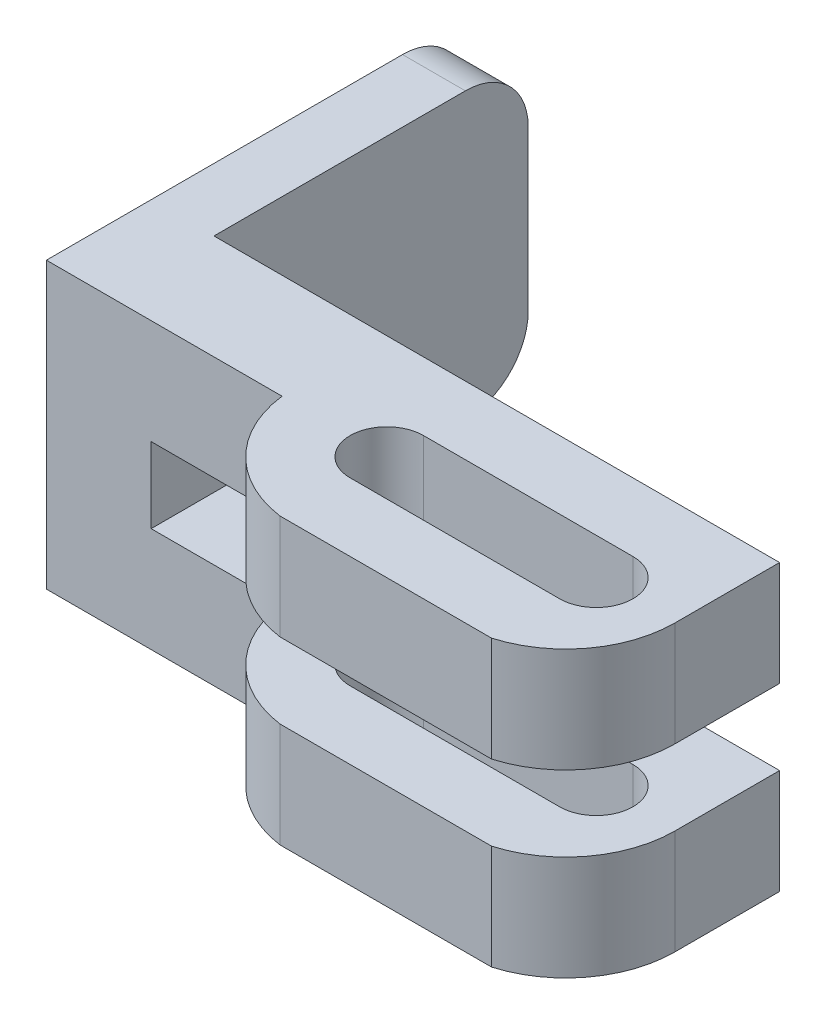
ISO-10303-21;
HEADER;
FILE_DESCRIPTION(('STEP AP214'),'2;1');
FILE_NAME('part.step','',(''),(''),'','','');
FILE_SCHEMA(('AUTOMOTIVE_DESIGN { 1 0 10303 214 1 1 1 1 }'));
ENDSEC;
DATA;
#1=APPLICATION_CONTEXT('core data for automotive mechanical design processes');
#2=APPLICATION_PROTOCOL_DEFINITION('international standard','automotive_design',2000,#1);
#3=PRODUCT_CONTEXT('',#1,'mechanical');
#4=PRODUCT('Part','Part','',(#3));
#5=PRODUCT_RELATED_PRODUCT_CATEGORY('part','',(#4));
#6=PRODUCT_DEFINITION_FORMATION('','',#4);
#7=PRODUCT_DEFINITION_CONTEXT('part definition',#1,'design');
#8=PRODUCT_DEFINITION('design','',#6,#7);
#9=PRODUCT_DEFINITION_SHAPE('','',#8);
#10=(LENGTH_UNIT() NAMED_UNIT(*) SI_UNIT(.MILLI.,.METRE.));
#11=(NAMED_UNIT(*) PLANE_ANGLE_UNIT() SI_UNIT($,.RADIAN.));
#12=(NAMED_UNIT(*) SI_UNIT($,.STERADIAN.) SOLID_ANGLE_UNIT());
#13=UNCERTAINTY_MEASURE_WITH_UNIT(LENGTH_MEASURE(1.E-05),#10,'distance_accuracy_value','');
#14=(GEOMETRIC_REPRESENTATION_CONTEXT(3) GLOBAL_UNCERTAINTY_ASSIGNED_CONTEXT((#13)) GLOBAL_UNIT_ASSIGNED_CONTEXT((#10,
#11,#12)) REPRESENTATION_CONTEXT('',''));
#15=CARTESIAN_POINT('',(0.,0.,0.));
#16=DIRECTION('',(0.,0.,1.));
#17=DIRECTION('',(1.,0.,0.));
#18=AXIS2_PLACEMENT_3D('',#15,#16,#17);
#19=CARTESIAN_POINT('',(0.,0.,0.));
#20=DIRECTION('',(0.,0.,1.));
#21=DIRECTION('',(1.,0.,0.));
#22=AXIS2_PLACEMENT_3D('',#19,#20,#21);
#23=PLANE('',#22);
#24=DIRECTION('',(0.,-1.,0.));
#25=VECTOR('',#24,1.);
#26=CARTESIAN_POINT('',(63.,0.,0.));
#27=LINE('',#26,#25);
#28=CARTESIAN_POINT('',(62.9999999999999,6.80000000000001,0.));
#29=VERTEX_POINT('',#28);
#30=CARTESIAN_POINT('',(63.,-6.79999999999999,0.));
#31=VERTEX_POINT('',#30);
#32=EDGE_CURVE('E322',#29,#31,#27,.T.);
#33=ORIENTED_EDGE('',*,*,#32,.F.);
#34=DIRECTION('',(-1.,0.,0.));
#35=VECTOR('',#34,1.);
#36=CARTESIAN_POINT('',(-90.,6.79999999999999,0.));
#37=LINE('',#36,#35);
#38=CARTESIAN_POINT('',(90.,6.80000000000001,0.));
#39=VERTEX_POINT('',#38);
#40=EDGE_CURVE('E376',#39,#29,#37,.T.);
#41=ORIENTED_EDGE('',*,*,#40,.F.);
#42=DIRECTION('',(0.,1.,0.));
#43=VECTOR('',#42,1.);
#44=CARTESIAN_POINT('',(90.,6.80000000000001,0.));
#45=LINE('',#44,#43);
#46=CARTESIAN_POINT('',(90.,1.80000000000001,0.));
#47=VERTEX_POINT('',#46);
#48=EDGE_CURVE('E399',#47,#39,#45,.T.);
#49=ORIENTED_EDGE('',*,*,#48,.F.);
#50=DIRECTION('',(1.,0.,0.));
#51=VECTOR('',#50,1.);
#52=CARTESIAN_POINT('',(90.,1.80000000000001,0.));
#53=LINE('',#52,#51);
#54=CARTESIAN_POINT('',(65.,1.80000000000001,0.));
#55=VERTEX_POINT('',#54);
#56=EDGE_CURVE('E396',#55,#47,#53,.T.);
#57=ORIENTED_EDGE('',*,*,#56,.F.);
#58=DIRECTION('',(0.,1.,0.));
#59=VECTOR('',#58,1.);
#60=CARTESIAN_POINT('',(65.,-1.79999999999999,0.));
#61=LINE('',#60,#59);
#62=CARTESIAN_POINT('',(65.,-1.79999999999999,0.));
#63=VERTEX_POINT('',#62);
#64=EDGE_CURVE('E393',#63,#55,#61,.T.);
#65=ORIENTED_EDGE('',*,*,#64,.F.);
#66=DIRECTION('',(-1.,0.,0.));
#67=VECTOR('',#66,1.);
#68=CARTESIAN_POINT('',(90.,-1.79999999999999,0.));
#69=LINE('',#68,#67);
#70=CARTESIAN_POINT('',(90.,-1.79999999999999,0.));
#71=VERTEX_POINT('',#70);
#72=EDGE_CURVE('E390',#71,#63,#69,.T.);
#73=ORIENTED_EDGE('',*,*,#72,.F.);
#74=DIRECTION('',(0.,1.,0.));
#75=VECTOR('',#74,1.);
#76=CARTESIAN_POINT('',(90.,-6.79999999999999,0.));
#77=LINE('',#76,#75);
#78=CARTESIAN_POINT('',(90.,-6.79999999999999,0.));
#79=VERTEX_POINT('',#78);
#80=EDGE_CURVE('E387',#79,#71,#77,.T.);
#81=ORIENTED_EDGE('',*,*,#80,.F.);
#82=DIRECTION('',(1.,0.,0.));
#83=VECTOR('',#82,1.);
#84=CARTESIAN_POINT('',(-90.,-6.80000000000001,0.));
#85=LINE('',#84,#83);
#86=EDGE_CURVE('E371',#31,#79,#85,.T.);
#87=ORIENTED_EDGE('',*,*,#86,.F.);
#88=EDGE_LOOP('',(#33,#41,#49,#57,#65,#73,#81,#87));
#89=FACE_BOUND('',#88,.T.);
#90=ADVANCED_FACE('F127',(#89),#23,.F.);
#91=CARTESIAN_POINT('',(-90.,-6.80000000000001,10.));
#92=DIRECTION('',(0.,1.,0.));
#93=DIRECTION('',(-1.,0.,0.));
#94=AXIS2_PLACEMENT_3D('',#91,#92,#93);
#95=PLANE('',#94);
#96=CARTESIAN_POINT('',(86.25,-6.80000000000001,5.));
#97=DIRECTION('',(0.,1.,0.));
#98=DIRECTION('',(0.,0.,1.));
#99=AXIS2_PLACEMENT_3D('',#96,#97,#98);
#100=CIRCLE('',#99,1.75);
#101=CARTESIAN_POINT('',(86.25,-6.80000000000001,3.25));
#102=VERTEX_POINT('',#101);
#103=CARTESIAN_POINT('',(86.25,-6.80000000000001,6.75));
#104=VERTEX_POINT('',#103);
#105=EDGE_CURVE('E464',#102,#104,#100,.F.);
#106=ORIENTED_EDGE('',*,*,#105,.F.);
#107=DIRECTION('',(-1.,0.,0.));
#108=VECTOR('',#107,1.);
#109=CARTESIAN_POINT('',(0.,-6.80000000000001,3.25));
#110=LINE('',#109,#108);
#111=CARTESIAN_POINT('',(76.25,-6.79999999999999,3.25));
#112=VERTEX_POINT('',#111);
#113=EDGE_CURVE('E466',#102,#112,#110,.T.);
#114=ORIENTED_EDGE('',*,*,#113,.T.);
#115=CARTESIAN_POINT('',(76.25,-6.80000000000001,5.));
#116=DIRECTION('',(0.,1.,0.));
#117=DIRECTION('',(0.,0.,1.));
#118=AXIS2_PLACEMENT_3D('',#115,#116,#117);
#119=CIRCLE('',#118,1.75);
#120=CARTESIAN_POINT('',(76.25,-6.80000000000001,6.75));
#121=VERTEX_POINT('',#120);
#122=EDGE_CURVE('E470',#112,#121,#119,.T.);
#123=ORIENTED_EDGE('',*,*,#122,.T.);
#124=DIRECTION('',(-1.,0.,0.));
#125=VECTOR('',#124,1.);
#126=CARTESIAN_POINT('',(0.,-6.80000000000001,6.75));
#127=LINE('',#126,#125);
#128=EDGE_CURVE('E473',#104,#121,#127,.T.);
#129=ORIENTED_EDGE('',*,*,#128,.F.);
#130=EDGE_LOOP('',(#106,#114,#123,#129));
#131=FACE_BOUND('',#130,.T.);
#132=DIRECTION('',(1.,0.,0.));
#133=VECTOR('',#132,1.);
#134=CARTESIAN_POINT('',(0.,-6.80000000000001,5.));
#135=LINE('',#134,#133);
#136=CARTESIAN_POINT('',(60.,-6.79999999999999,5.));
#137=VERTEX_POINT('',#136);
#138=CARTESIAN_POINT('',(71.25,-6.80000000000001,5.));
#139=VERTEX_POINT('',#138);
#140=EDGE_CURVE('E318',#137,#139,#135,.T.);
#141=ORIENTED_EDGE('',*,*,#140,.F.);
#142=DIRECTION('',(0.,0.,1.));
#143=VECTOR('',#142,1.);
#144=CARTESIAN_POINT('',(60.,-6.79999999999999,-15.));
#145=LINE('',#144,#143);
#146=CARTESIAN_POINT('',(60.,-6.79999999999999,-12.));
#147=VERTEX_POINT('',#146);
#148=EDGE_CURVE('E302',#147,#137,#145,.T.);
#149=ORIENTED_EDGE('',*,*,#148,.F.);
#150=DIRECTION('',(-1.,0.,0.));
#151=VECTOR('',#150,1.);
#152=CARTESIAN_POINT('',(63.,-6.79999999999999,-12.));
#153=LINE('',#152,#151);
#154=CARTESIAN_POINT('',(63.,-6.79999999999999,-12.));
#155=VERTEX_POINT('',#154);
#156=EDGE_CURVE('E432',#147,#155,#153,.F.);
#157=ORIENTED_EDGE('',*,*,#156,.T.);
#158=DIRECTION('',(0.,0.,1.));
#159=VECTOR('',#158,1.);
#160=CARTESIAN_POINT('',(63.,-6.79999999999999,-15.));
#161=LINE('',#160,#159);
#162=EDGE_CURVE('E312',#155,#31,#161,.T.);
#163=ORIENTED_EDGE('',*,*,#162,.T.);
#164=ORIENTED_EDGE('',*,*,#86,.T.);
#165=DIRECTION('',(0.,0.,-1.));
#166=VECTOR('',#165,1.);
#167=CARTESIAN_POINT('',(90.,-6.79999999999999,10.));
#168=LINE('',#167,#166);
#169=CARTESIAN_POINT('',(90.,-6.80000000000001,5.));
#170=VERTEX_POINT('',#169);
#171=EDGE_CURVE('E413',#170,#79,#168,.T.);
#172=ORIENTED_EDGE('',*,*,#171,.F.);
#173=CARTESIAN_POINT('',(84.7916666666666,-6.80000000000001,5.));
#174=DIRECTION('',(0.,1.,0.));
#175=DIRECTION('',(0.,0.,1.));
#176=AXIS2_PLACEMENT_3D('',#173,#174,#175);
#177=CIRCLE('',#176,5.20833333333336);
#178=CARTESIAN_POINT('',(86.25,-6.80000000000001,10.));
#179=VERTEX_POINT('',#178);
#180=EDGE_CURVE('E501',#170,#179,#177,.F.);
#181=ORIENTED_EDGE('',*,*,#180,.T.);
#182=DIRECTION('',(1.,0.,0.));
#183=VECTOR('',#182,1.);
#184=CARTESIAN_POINT('',(-90.,-6.80000000000001,10.));
#185=LINE('',#184,#183);
#186=CARTESIAN_POINT('',(76.15,-6.80000000000001,10.));
#187=VERTEX_POINT('',#186);
#188=EDGE_CURVE('E372',#187,#179,#185,.T.);
#189=ORIENTED_EDGE('',*,*,#188,.F.);
#190=CARTESIAN_POINT('',(76.9398616508435,-6.80000000000001,4.32493558217343));
#191=DIRECTION('',(0.,1.,0.));
#192=DIRECTION('',(0.,0.,1.));
#193=AXIS2_PLACEMENT_3D('',#190,#191,#192);
#194=CIRCLE('',#193,5.72976767190037);
#195=EDGE_CURVE('E327',#187,#139,#194,.F.);
#196=ORIENTED_EDGE('',*,*,#195,.T.);
#197=EDGE_LOOP('',(#141,#149,#157,#163,#164,#172,#181,#189,#196));
#198=FACE_BOUND('',#197,.T.);
#199=ADVANCED_FACE('F325',(#131,#198),#95,.F.);
#200=CARTESIAN_POINT('',(-90.,6.79999999999999,10.));
#201=DIRECTION('',(0.,-1.,0.));
#202=DIRECTION('',(1.,0.,0.));
#203=AXIS2_PLACEMENT_3D('',#200,#201,#202);
#204=PLANE('',#203);
#205=CARTESIAN_POINT('',(86.25,6.8,5.));
#206=DIRECTION('',(0.,1.,0.));
#207=DIRECTION('',(0.,0.,1.));
#208=AXIS2_PLACEMENT_3D('',#205,#206,#207);
#209=CIRCLE('',#208,1.75);
#210=CARTESIAN_POINT('',(86.25,6.80000000000001,3.25));
#211=VERTEX_POINT('',#210);
#212=CARTESIAN_POINT('',(86.25,6.8,6.75));
#213=VERTEX_POINT('',#212);
#214=EDGE_CURVE('E463',#211,#213,#209,.F.);
#215=ORIENTED_EDGE('',*,*,#214,.T.);
#216=DIRECTION('',(-1.,0.,0.));
#217=VECTOR('',#216,1.);
#218=CARTESIAN_POINT('',(0.,6.8,6.75));
#219=LINE('',#218,#217);
#220=CARTESIAN_POINT('',(76.25,6.8,6.75));
#221=VERTEX_POINT('',#220);
#222=EDGE_CURVE('E467',#213,#221,#219,.T.);
#223=ORIENTED_EDGE('',*,*,#222,.T.);
#224=CARTESIAN_POINT('',(76.25,6.8,5.));
#225=DIRECTION('',(0.,1.,0.));
#226=DIRECTION('',(0.,0.,1.));
#227=AXIS2_PLACEMENT_3D('',#224,#225,#226);
#228=CIRCLE('',#227,1.75);
#229=CARTESIAN_POINT('',(76.25,6.8,3.25));
#230=VERTEX_POINT('',#229);
#231=EDGE_CURVE('E481',#230,#221,#228,.T.);
#232=ORIENTED_EDGE('',*,*,#231,.F.);
#233=DIRECTION('',(-1.,0.,0.));
#234=VECTOR('',#233,1.);
#235=CARTESIAN_POINT('',(0.,6.8,3.25));
#236=LINE('',#235,#234);
#237=EDGE_CURVE('E478',#211,#230,#236,.T.);
#238=ORIENTED_EDGE('',*,*,#237,.F.);
#239=EDGE_LOOP('',(#215,#223,#232,#238));
#240=FACE_BOUND('',#239,.T.);
#241=DIRECTION('',(0.,0.,1.));
#242=VECTOR('',#241,1.);
#243=CARTESIAN_POINT('',(60.,6.80000000000001,-15.));
#244=LINE('',#243,#242);
#245=CARTESIAN_POINT('',(60.,6.80000000000001,-12.));
#246=VERTEX_POINT('',#245);
#247=CARTESIAN_POINT('',(60.,6.80000000000003,5.));
#248=VERTEX_POINT('',#247);
#249=EDGE_CURVE('E448',#246,#248,#244,.T.);
#250=ORIENTED_EDGE('',*,*,#249,.T.);
#251=DIRECTION('',(1.,0.,0.));
#252=VECTOR('',#251,1.);
#253=CARTESIAN_POINT('',(0.,6.8,5.));
#254=LINE('',#253,#252);
#255=CARTESIAN_POINT('',(71.25,6.8,5.));
#256=VERTEX_POINT('',#255);
#257=EDGE_CURVE('E321',#248,#256,#254,.T.);
#258=ORIENTED_EDGE('',*,*,#257,.T.);
#259=CARTESIAN_POINT('',(76.9398616508435,6.8,4.32493558217343));
#260=DIRECTION('',(0.,1.,0.));
#261=DIRECTION('',(0.,0.,1.));
#262=AXIS2_PLACEMENT_3D('',#259,#260,#261);
#263=CIRCLE('',#262,5.72976767190037);
#264=CARTESIAN_POINT('',(76.15,6.8,10.));
#265=VERTEX_POINT('',#264);
#266=EDGE_CURVE('E335',#265,#256,#263,.F.);
#267=ORIENTED_EDGE('',*,*,#266,.F.);
#268=DIRECTION('',(-1.,0.,0.));
#269=VECTOR('',#268,1.);
#270=CARTESIAN_POINT('',(-90.,6.79999999999999,10.));
#271=LINE('',#270,#269);
#272=CARTESIAN_POINT('',(86.2499999999999,6.80000000000001,10.));
#273=VERTEX_POINT('',#272);
#274=EDGE_CURVE('E382',#273,#265,#271,.T.);
#275=ORIENTED_EDGE('',*,*,#274,.F.);
#276=CARTESIAN_POINT('',(84.7916666666666,6.8,5.));
#277=DIRECTION('',(0.,1.,0.));
#278=DIRECTION('',(0.,0.,1.));
#279=AXIS2_PLACEMENT_3D('',#276,#277,#278);
#280=CIRCLE('',#279,5.20833333333336);
#281=CARTESIAN_POINT('',(90.,6.8,5.));
#282=VERTEX_POINT('',#281);
#283=EDGE_CURVE('E489',#282,#273,#280,.F.);
#284=ORIENTED_EDGE('',*,*,#283,.F.);
#285=DIRECTION('',(0.,0.,-1.));
#286=VECTOR('',#285,1.);
#287=CARTESIAN_POINT('',(90.,6.80000000000001,10.));
#288=LINE('',#287,#286);
#289=EDGE_CURVE('E385',#282,#39,#288,.T.);
#290=ORIENTED_EDGE('',*,*,#289,.T.);
#291=ORIENTED_EDGE('',*,*,#40,.T.);
#292=DIRECTION('',(0.,0.,1.));
#293=VECTOR('',#292,1.);
#294=CARTESIAN_POINT('',(63.,6.80000000000001,-15.));
#295=LINE('',#294,#293);
#296=CARTESIAN_POINT('',(63.,6.80000000000001,-12.));
#297=VERTEX_POINT('',#296);
#298=EDGE_CURVE('E443',#297,#29,#295,.T.);
#299=ORIENTED_EDGE('',*,*,#298,.F.);
#300=DIRECTION('',(1.,0.,0.));
#301=VECTOR('',#300,1.);
#302=CARTESIAN_POINT('',(60.,6.80000000000001,-12.));
#303=LINE('',#302,#301);
#304=EDGE_CURVE('E430',#297,#246,#303,.F.);
#305=ORIENTED_EDGE('',*,*,#304,.T.);
#306=EDGE_LOOP('',(#250,#258,#267,#275,#284,#290,#291,#299,#305));
#307=FACE_BOUND('',#306,.T.);
#308=ADVANCED_FACE('F446',(#240,#307),#204,.F.);
#309=CARTESIAN_POINT('',(90.,-1.79999999999999,10.));
#310=DIRECTION('',(0.,-1.,0.));
#311=DIRECTION('',(1.,0.,0.));
#312=AXIS2_PLACEMENT_3D('',#309,#310,#311);
#313=PLANE('',#312);
#314=CARTESIAN_POINT('',(86.25,-1.79999999999999,5.));
#315=DIRECTION('',(0.,-1.,0.));
#316=DIRECTION('',(1.,0.,0.));
#317=AXIS2_PLACEMENT_3D('',#314,#315,#316);
#318=CIRCLE('',#317,1.75);
#319=CARTESIAN_POINT('',(86.25,-1.79999999999999,6.75));
#320=VERTEX_POINT('',#319);
#321=CARTESIAN_POINT('',(86.25,-1.79999999999999,3.25));
#322=VERTEX_POINT('',#321);
#323=EDGE_CURVE('E368',#320,#322,#318,.F.);
#324=ORIENTED_EDGE('',*,*,#323,.F.);
#325=DIRECTION('',(1.,0.,0.));
#326=VECTOR('',#325,1.);
#327=CARTESIAN_POINT('',(90.,-1.79999999999999,6.75));
#328=LINE('',#327,#326);
#329=CARTESIAN_POINT('',(76.25,-1.79999999999999,6.75));
#330=VERTEX_POINT('',#329);
#331=EDGE_CURVE('E366',#330,#320,#328,.T.);
#332=ORIENTED_EDGE('',*,*,#331,.F.);
#333=CARTESIAN_POINT('',(76.25,-1.79999999999999,5.));
#334=DIRECTION('',(0.,-1.,0.));
#335=DIRECTION('',(1.,0.,0.));
#336=AXIS2_PLACEMENT_3D('',#333,#334,#335);
#337=CIRCLE('',#336,1.75);
#338=CARTESIAN_POINT('',(76.25,-1.79999999999999,3.25));
#339=VERTEX_POINT('',#338);
#340=EDGE_CURVE('E363',#330,#339,#337,.T.);
#341=ORIENTED_EDGE('',*,*,#340,.T.);
#342=DIRECTION('',(1.,0.,0.));
#343=VECTOR('',#342,1.);
#344=CARTESIAN_POINT('',(90.,-1.79999999999999,3.25));
#345=LINE('',#344,#343);
#346=EDGE_CURVE('E360',#339,#322,#345,.T.);
#347=ORIENTED_EDGE('',*,*,#346,.T.);
#348=EDGE_LOOP('',(#324,#332,#341,#347));
#349=FACE_BOUND('',#348,.T.);
#350=DIRECTION('',(-1.,0.,0.));
#351=VECTOR('',#350,1.);
#352=CARTESIAN_POINT('',(90.,-1.79999999999999,10.));
#353=LINE('',#352,#351);
#354=CARTESIAN_POINT('',(86.25,-1.79999999999999,10.));
#355=VERTEX_POINT('',#354);
#356=CARTESIAN_POINT('',(76.15,-1.79999999999999,10.));
#357=VERTEX_POINT('',#356);
#358=EDGE_CURVE('E375',#355,#357,#353,.T.);
#359=ORIENTED_EDGE('',*,*,#358,.F.);
#360=CARTESIAN_POINT('',(84.7916666666666,-1.79999999999999,5.));
#361=DIRECTION('',(0.,-1.,0.));
#362=DIRECTION('',(1.,0.,0.));
#363=AXIS2_PLACEMENT_3D('',#360,#361,#362);
#364=CIRCLE('',#363,5.20833333333336);
#365=CARTESIAN_POINT('',(90.,-1.79999999999999,5.));
#366=VERTEX_POINT('',#365);
#367=EDGE_CURVE('E351',#355,#366,#364,.F.);
#368=ORIENTED_EDGE('',*,*,#367,.T.);
#369=DIRECTION('',(0.,0.,-1.));
#370=VECTOR('',#369,1.);
#371=CARTESIAN_POINT('',(90.,-1.79999999999999,10.));
#372=LINE('',#371,#370);
#373=EDGE_CURVE('E411',#366,#71,#372,.T.);
#374=ORIENTED_EDGE('',*,*,#373,.T.);
#375=ORIENTED_EDGE('',*,*,#72,.T.);
#376=DIRECTION('',(0.,0.,-1.));
#377=VECTOR('',#376,1.);
#378=CARTESIAN_POINT('',(65.,-1.79999999999999,10.));
#379=LINE('',#378,#377);
#380=CARTESIAN_POINT('',(65.,-1.79999999999999,5.));
#381=VERTEX_POINT('',#380);
#382=EDGE_CURVE('E409',#381,#63,#379,.T.);
#383=ORIENTED_EDGE('',*,*,#382,.F.);
#384=DIRECTION('',(-1.,0.,0.));
#385=VECTOR('',#384,1.);
#386=CARTESIAN_POINT('',(90.,-1.79999999999999,5.));
#387=LINE('',#386,#385);
#388=CARTESIAN_POINT('',(71.25,-1.79999999999999,5.));
#389=VERTEX_POINT('',#388);
#390=EDGE_CURVE('E358',#389,#381,#387,.T.);
#391=ORIENTED_EDGE('',*,*,#390,.F.);
#392=CARTESIAN_POINT('',(76.9398616508435,-1.79999999999999,4.32493558217343));
#393=DIRECTION('',(0.,-1.,0.));
#394=DIRECTION('',(1.,0.,0.));
#395=AXIS2_PLACEMENT_3D('',#392,#393,#394);
#396=CIRCLE('',#395,5.72976767190037);
#397=EDGE_CURVE('E345',#389,#357,#396,.F.);
#398=ORIENTED_EDGE('',*,*,#397,.T.);
#399=EDGE_LOOP('',(#359,#368,#374,#375,#383,#391,#398));
#400=FACE_BOUND('',#399,.T.);
#401=ADVANCED_FACE('F544',(#349,#400),#313,.F.);
#402=CARTESIAN_POINT('',(65.,-1.79999999999999,10.));
#403=DIRECTION('',(-1.,0.,0.));
#404=DIRECTION('',(0.,0.,1.));
#405=AXIS2_PLACEMENT_3D('',#402,#403,#404);
#406=PLANE('',#405);
#407=DIRECTION('',(0.,1.,0.));
#408=VECTOR('',#407,1.);
#409=CARTESIAN_POINT('',(65.,-1.79999999999999,5.));
#410=LINE('',#409,#408);
#411=CARTESIAN_POINT('',(65.,1.80000000000001,5.));
#412=VERTEX_POINT('',#411);
#413=EDGE_CURVE('E356',#381,#412,#410,.T.);
#414=ORIENTED_EDGE('',*,*,#413,.F.);
#415=ORIENTED_EDGE('',*,*,#382,.T.);
#416=ORIENTED_EDGE('',*,*,#64,.T.);
#417=DIRECTION('',(0.,0.,-1.));
#418=VECTOR('',#417,1.);
#419=CARTESIAN_POINT('',(65.,1.80000000000001,10.));
#420=LINE('',#419,#418);
#421=EDGE_CURVE('E407',#412,#55,#420,.T.);
#422=ORIENTED_EDGE('',*,*,#421,.F.);
#423=EDGE_LOOP('',(#414,#415,#416,#422));
#424=FACE_BOUND('',#423,.T.);
#425=ADVANCED_FACE('F553',(#424),#406,.F.);
#426=CARTESIAN_POINT('',(90.,1.80000000000001,10.));
#427=DIRECTION('',(0.,1.,0.));
#428=DIRECTION('',(-1.,0.,0.));
#429=AXIS2_PLACEMENT_3D('',#426,#427,#428);
#430=PLANE('',#429);
#431=CARTESIAN_POINT('',(86.25,1.80000000000001,5.));
#432=DIRECTION('',(0.,1.,0.));
#433=DIRECTION('',(-1.,0.,0.));
#434=AXIS2_PLACEMENT_3D('',#431,#432,#433);
#435=CIRCLE('',#434,1.75);
#436=CARTESIAN_POINT('',(86.25,1.80000000000001,3.25));
#437=VERTEX_POINT('',#436);
#438=CARTESIAN_POINT('',(86.25,1.80000000000001,6.75));
#439=VERTEX_POINT('',#438);
#440=EDGE_CURVE('E428',#437,#439,#435,.F.);
#441=ORIENTED_EDGE('',*,*,#440,.F.);
#442=DIRECTION('',(-1.,0.,0.));
#443=VECTOR('',#442,1.);
#444=CARTESIAN_POINT('',(90.,1.80000000000001,3.25));
#445=LINE('',#444,#443);
#446=CARTESIAN_POINT('',(76.25,1.80000000000001,3.25));
#447=VERTEX_POINT('',#446);
#448=EDGE_CURVE('E420',#437,#447,#445,.T.);
#449=ORIENTED_EDGE('',*,*,#448,.T.);
#450=CARTESIAN_POINT('',(76.25,1.80000000000001,5.));
#451=DIRECTION('',(0.,1.,0.));
#452=DIRECTION('',(-1.,0.,0.));
#453=AXIS2_PLACEMENT_3D('',#450,#451,#452);
#454=CIRCLE('',#453,1.75);
#455=CARTESIAN_POINT('',(76.25,1.80000000000001,6.75));
#456=VERTEX_POINT('',#455);
#457=EDGE_CURVE('E423',#447,#456,#454,.T.);
#458=ORIENTED_EDGE('',*,*,#457,.T.);
#459=DIRECTION('',(-1.,0.,0.));
#460=VECTOR('',#459,1.);
#461=CARTESIAN_POINT('',(90.,1.80000000000001,6.75));
#462=LINE('',#461,#460);
#463=EDGE_CURVE('E426',#439,#456,#462,.T.);
#464=ORIENTED_EDGE('',*,*,#463,.F.);
#465=EDGE_LOOP('',(#441,#449,#458,#464));
#466=FACE_BOUND('',#465,.T.);
#467=DIRECTION('',(0.,0.,-1.));
#468=VECTOR('',#467,1.);
#469=CARTESIAN_POINT('',(90.,1.80000000000001,10.));
#470=LINE('',#469,#468);
#471=CARTESIAN_POINT('',(90.,1.80000000000001,5.));
#472=VERTEX_POINT('',#471);
#473=EDGE_CURVE('E405',#472,#47,#470,.T.);
#474=ORIENTED_EDGE('',*,*,#473,.F.);
#475=CARTESIAN_POINT('',(84.7916666666666,1.80000000000001,5.));
#476=DIRECTION('',(0.,1.,0.));
#477=DIRECTION('',(-1.,0.,0.));
#478=AXIS2_PLACEMENT_3D('',#475,#476,#477);
#479=CIRCLE('',#478,5.20833333333336);
#480=CARTESIAN_POINT('',(86.25,1.80000000000001,10.));
#481=VERTEX_POINT('',#480);
#482=EDGE_CURVE('E348',#472,#481,#479,.F.);
#483=ORIENTED_EDGE('',*,*,#482,.T.);
#484=DIRECTION('',(1.,0.,0.));
#485=VECTOR('',#484,1.);
#486=CARTESIAN_POINT('',(90.,1.80000000000001,10.));
#487=LINE('',#486,#485);
#488=CARTESIAN_POINT('',(76.1499999999999,1.80000000000001,10.));
#489=VERTEX_POINT('',#488);
#490=EDGE_CURVE('E379',#489,#481,#487,.T.);
#491=ORIENTED_EDGE('',*,*,#490,.F.);
#492=CARTESIAN_POINT('',(76.9398616508435,1.80000000000001,4.32493558217343));
#493=DIRECTION('',(0.,1.,0.));
#494=DIRECTION('',(-1.,0.,0.));
#495=AXIS2_PLACEMENT_3D('',#492,#493,#494);
#496=CIRCLE('',#495,5.72976767190037);
#497=CARTESIAN_POINT('',(71.25,1.80000000000001,5.));
#498=VERTEX_POINT('',#497);
#499=EDGE_CURVE('E341',#489,#498,#496,.F.);
#500=ORIENTED_EDGE('',*,*,#499,.T.);
#501=DIRECTION('',(1.,0.,0.));
#502=VECTOR('',#501,1.);
#503=CARTESIAN_POINT('',(90.,1.80000000000001,5.));
#504=LINE('',#503,#502);
#505=EDGE_CURVE('E354',#412,#498,#504,.T.);
#506=ORIENTED_EDGE('',*,*,#505,.F.);
#507=ORIENTED_EDGE('',*,*,#421,.T.);
#508=ORIENTED_EDGE('',*,*,#56,.T.);
#509=EDGE_LOOP('',(#474,#483,#491,#500,#506,#507,#508));
#510=FACE_BOUND('',#509,.T.);
#511=ADVANCED_FACE('F549',(#466,#510),#430,.F.);
#512=CARTESIAN_POINT('',(0.,0.,10.));
#513=DIRECTION('',(0.,0.,1.));
#514=DIRECTION('',(1.,0.,0.));
#515=AXIS2_PLACEMENT_3D('',#512,#513,#514);
#516=PLANE('',#515);
#517=DIRECTION('',(0.,1.,0.));
#518=VECTOR('',#517,1.);
#519=CARTESIAN_POINT('',(86.25,-6.80000000000001,10.));
#520=LINE('',#519,#518);
#521=EDGE_CURVE('E338',#179,#355,#520,.T.);
#522=ORIENTED_EDGE('',*,*,#521,.T.);
#523=ORIENTED_EDGE('',*,*,#358,.T.);
#524=DIRECTION('',(0.,1.,0.));
#525=VECTOR('',#524,1.);
#526=CARTESIAN_POINT('',(76.15,-6.80000000000001,10.));
#527=LINE('',#526,#525);
#528=EDGE_CURVE('E328',#187,#357,#527,.T.);
#529=ORIENTED_EDGE('',*,*,#528,.F.);
#530=ORIENTED_EDGE('',*,*,#188,.T.);
#531=EDGE_LOOP('',(#522,#523,#529,#530));
#532=FACE_BOUND('',#531,.T.);
#533=ADVANCED_FACE('F552',(#532),#516,.T.);
#534=CARTESIAN_POINT('',(90.,-6.79999999999999,10.));
#535=DIRECTION('',(-1.,0.,0.));
#536=DIRECTION('',(0.,0.,1.));
#537=AXIS2_PLACEMENT_3D('',#534,#535,#536);
#538=PLANE('',#537);
#539=ORIENTED_EDGE('',*,*,#373,.F.);
#540=DIRECTION('',(0.,1.,0.));
#541=VECTOR('',#540,1.);
#542=CARTESIAN_POINT('',(90.,-6.80000000000001,5.));
#543=LINE('',#542,#541);
#544=EDGE_CURVE('E507',#170,#366,#543,.T.);
#545=ORIENTED_EDGE('',*,*,#544,.F.);
#546=ORIENTED_EDGE('',*,*,#171,.T.);
#547=ORIENTED_EDGE('',*,*,#80,.T.);
#548=EDGE_LOOP('',(#539,#545,#546,#547));
#549=FACE_BOUND('',#548,.T.);
#550=ADVANCED_FACE('F548',(#549),#538,.F.);
#551=CARTESIAN_POINT('',(90.,6.80000000000001,10.));
#552=DIRECTION('',(-1.,0.,0.));
#553=DIRECTION('',(0.,0.,1.));
#554=AXIS2_PLACEMENT_3D('',#551,#552,#553);
#555=PLANE('',#554);
#556=ORIENTED_EDGE('',*,*,#289,.F.);
#557=EDGE_CURVE('E504',#472,#282,#543,.T.);
#558=ORIENTED_EDGE('',*,*,#557,.F.);
#559=ORIENTED_EDGE('',*,*,#473,.T.);
#560=ORIENTED_EDGE('',*,*,#48,.T.);
#561=EDGE_LOOP('',(#556,#558,#559,#560));
#562=FACE_BOUND('',#561,.T.);
#563=ADVANCED_FACE('F520',(#562),#555,.F.);
#564=DIRECTION('',(0.,1.,0.));
#565=VECTOR('',#564,1.);
#566=CARTESIAN_POINT('',(86.25,-6.80000000000001,10.));
#567=LINE('',#566,#565);
#568=EDGE_CURVE('E418',#273,#481,#567,.F.);
#569=ORIENTED_EDGE('',*,*,#568,.F.);
#570=ORIENTED_EDGE('',*,*,#274,.T.);
#571=DIRECTION('',(0.,1.,0.));
#572=VECTOR('',#571,1.);
#573=CARTESIAN_POINT('',(76.1499999999999,-6.80000000000001,10.));
#574=LINE('',#573,#572);
#575=EDGE_CURVE('E416',#489,#265,#574,.T.);
#576=ORIENTED_EDGE('',*,*,#575,.F.);
#577=ORIENTED_EDGE('',*,*,#490,.T.);
#578=EDGE_LOOP('',(#569,#570,#576,#577));
#579=FACE_BOUND('',#578,.T.);
#580=ADVANCED_FACE('F540',(#579),#516,.T.);
#581=CARTESIAN_POINT('',(0.,-6.80000000000001,5.));
#582=DIRECTION('',(0.,0.,1.));
#583=DIRECTION('',(1.,0.,0.));
#584=AXIS2_PLACEMENT_3D('',#581,#582,#583);
#585=PLANE('',#584);
#586=DIRECTION('',(0.,1.,0.));
#587=VECTOR('',#586,1.);
#588=CARTESIAN_POINT('',(60.,-6.80000000000001,5.));
#589=LINE('',#588,#587);
#590=EDGE_CURVE('E306',#137,#248,#589,.T.);
#591=ORIENTED_EDGE('',*,*,#590,.F.);
#592=ORIENTED_EDGE('',*,*,#140,.T.);
#593=DIRECTION('',(0.,1.,0.));
#594=VECTOR('',#593,1.);
#595=CARTESIAN_POINT('',(71.25,-6.80000000000001,5.));
#596=LINE('',#595,#594);
#597=EDGE_CURVE('E340',#139,#389,#596,.T.);
#598=ORIENTED_EDGE('',*,*,#597,.T.);
#599=ORIENTED_EDGE('',*,*,#390,.T.);
#600=ORIENTED_EDGE('',*,*,#413,.T.);
#601=ORIENTED_EDGE('',*,*,#505,.T.);
#602=EDGE_CURVE('E330',#498,#256,#596,.T.);
#603=ORIENTED_EDGE('',*,*,#602,.T.);
#604=ORIENTED_EDGE('',*,*,#257,.F.);
#605=EDGE_LOOP('',(#591,#592,#598,#599,#600,#601,#603,#604));
#606=FACE_BOUND('',#605,.T.);
#607=ADVANCED_FACE('F316',(#606),#585,.T.);
#608=CARTESIAN_POINT('',(76.9398616508435,-6.80000000000001,4.32493558217343));
#609=DIRECTION('',(0.,1.,0.));
#610=DIRECTION('',(0.,0.,1.));
#611=AXIS2_PLACEMENT_3D('',#608,#609,#610);
#612=CYLINDRICAL_SURFACE('',#611,5.72976767190037);
#613=ORIENTED_EDGE('',*,*,#597,.F.);
#614=ORIENTED_EDGE('',*,*,#195,.F.);
#615=ORIENTED_EDGE('',*,*,#528,.T.);
#616=ORIENTED_EDGE('',*,*,#397,.F.);
#617=EDGE_LOOP('',(#613,#614,#615,#616));
#618=FACE_BOUND('',#617,.T.);
#619=ADVANCED_FACE('F581',(#618),#612,.T.);
#620=ORIENTED_EDGE('',*,*,#575,.T.);
#621=ORIENTED_EDGE('',*,*,#266,.T.);
#622=ORIENTED_EDGE('',*,*,#602,.F.);
#623=ORIENTED_EDGE('',*,*,#499,.F.);
#624=EDGE_LOOP('',(#620,#621,#622,#623));
#625=FACE_BOUND('',#624,.T.);
#626=ADVANCED_FACE('F583',(#625),#612,.T.);
#627=CARTESIAN_POINT('',(84.7916666666666,-6.80000000000001,5.));
#628=DIRECTION('',(0.,1.,0.));
#629=DIRECTION('',(0.,0.,1.));
#630=AXIS2_PLACEMENT_3D('',#627,#628,#629);
#631=CYLINDRICAL_SURFACE('',#630,5.20833333333336);
#632=ORIENTED_EDGE('',*,*,#521,.F.);
#633=ORIENTED_EDGE('',*,*,#180,.F.);
#634=ORIENTED_EDGE('',*,*,#544,.T.);
#635=ORIENTED_EDGE('',*,*,#367,.F.);
#636=EDGE_LOOP('',(#632,#633,#634,#635));
#637=FACE_BOUND('',#636,.T.);
#638=ADVANCED_FACE('F574',(#637),#631,.T.);
#639=ORIENTED_EDGE('',*,*,#557,.T.);
#640=ORIENTED_EDGE('',*,*,#283,.T.);
#641=ORIENTED_EDGE('',*,*,#568,.T.);
#642=ORIENTED_EDGE('',*,*,#482,.F.);
#643=EDGE_LOOP('',(#639,#640,#641,#642));
#644=FACE_BOUND('',#643,.T.);
#645=ADVANCED_FACE('F513',(#644),#631,.T.);
#646=CARTESIAN_POINT('',(0.,-6.80000000000001,3.25));
#647=DIRECTION('',(0.,0.,-1.));
#648=DIRECTION('',(-1.,0.,0.));
#649=AXIS2_PLACEMENT_3D('',#646,#647,#648);
#650=PLANE('',#649);
#651=DIRECTION('',(0.,1.,0.));
#652=VECTOR('',#651,1.);
#653=CARTESIAN_POINT('',(86.25,-6.80000000000001,3.25));
#654=LINE('',#653,#652);
#655=EDGE_CURVE('E475',#437,#211,#654,.T.);
#656=ORIENTED_EDGE('',*,*,#655,.T.);
#657=ORIENTED_EDGE('',*,*,#237,.T.);
#658=DIRECTION('',(0.,1.,0.));
#659=VECTOR('',#658,1.);
#660=CARTESIAN_POINT('',(76.25,-6.80000000000001,3.25));
#661=LINE('',#660,#659);
#662=EDGE_CURVE('E498',#447,#230,#661,.T.);
#663=ORIENTED_EDGE('',*,*,#662,.F.);
#664=ORIENTED_EDGE('',*,*,#448,.F.);
#665=EDGE_LOOP('',(#656,#657,#663,#664));
#666=FACE_BOUND('',#665,.T.);
#667=ADVANCED_FACE('F604',(#666),#650,.F.);
#668=CARTESIAN_POINT('',(76.25,-6.80000000000001,5.));
#669=DIRECTION('',(0.,1.,0.));
#670=DIRECTION('',(0.,0.,1.));
#671=AXIS2_PLACEMENT_3D('',#668,#669,#670);
#672=CYLINDRICAL_SURFACE('',#671,1.75);
#673=ORIENTED_EDGE('',*,*,#662,.T.);
#674=ORIENTED_EDGE('',*,*,#231,.T.);
#675=DIRECTION('',(0.,1.,0.));
#676=VECTOR('',#675,1.);
#677=CARTESIAN_POINT('',(76.25,-6.80000000000001,6.75));
#678=LINE('',#677,#676);
#679=EDGE_CURVE('E494',#456,#221,#678,.T.);
#680=ORIENTED_EDGE('',*,*,#679,.F.);
#681=ORIENTED_EDGE('',*,*,#457,.F.);
#682=EDGE_LOOP('',(#673,#674,#680,#681));
#683=FACE_BOUND('',#682,.T.);
#684=ADVANCED_FACE('F608',(#683),#672,.F.);
#685=CARTESIAN_POINT('',(0.,-6.80000000000001,6.75));
#686=DIRECTION('',(0.,0.,-1.));
#687=DIRECTION('',(-1.,0.,0.));
#688=AXIS2_PLACEMENT_3D('',#685,#686,#687);
#689=PLANE('',#688);
#690=ORIENTED_EDGE('',*,*,#463,.T.);
#691=ORIENTED_EDGE('',*,*,#679,.T.);
#692=ORIENTED_EDGE('',*,*,#222,.F.);
#693=DIRECTION('',(0.,1.,0.));
#694=VECTOR('',#693,1.);
#695=CARTESIAN_POINT('',(86.25,-6.80000000000001,6.75));
#696=LINE('',#695,#694);
#697=EDGE_CURVE('E490',#439,#213,#696,.T.);
#698=ORIENTED_EDGE('',*,*,#697,.F.);
#699=EDGE_LOOP('',(#690,#691,#692,#698));
#700=FACE_BOUND('',#699,.T.);
#701=ADVANCED_FACE('F612',(#700),#689,.T.);
#702=CARTESIAN_POINT('',(86.25,-6.80000000000001,5.));
#703=DIRECTION('',(0.,1.,0.));
#704=DIRECTION('',(0.,0.,1.));
#705=AXIS2_PLACEMENT_3D('',#702,#703,#704);
#706=CYLINDRICAL_SURFACE('',#705,1.75);
#707=ORIENTED_EDGE('',*,*,#440,.T.);
#708=ORIENTED_EDGE('',*,*,#697,.T.);
#709=ORIENTED_EDGE('',*,*,#214,.F.);
#710=ORIENTED_EDGE('',*,*,#655,.F.);
#711=EDGE_LOOP('',(#707,#708,#709,#710));
#712=FACE_BOUND('',#711,.T.);
#713=ADVANCED_FACE('F597',(#712),#706,.F.);
#714=ORIENTED_EDGE('',*,*,#323,.T.);
#715=EDGE_CURVE('E499',#102,#322,#654,.T.);
#716=ORIENTED_EDGE('',*,*,#715,.F.);
#717=ORIENTED_EDGE('',*,*,#105,.T.);
#718=EDGE_CURVE('E486',#104,#320,#696,.T.);
#719=ORIENTED_EDGE('',*,*,#718,.T.);
#720=EDGE_LOOP('',(#714,#716,#717,#719));
#721=FACE_BOUND('',#720,.T.);
#722=ADVANCED_FACE('F593',(#721),#706,.F.);
#723=ORIENTED_EDGE('',*,*,#331,.T.);
#724=ORIENTED_EDGE('',*,*,#718,.F.);
#725=ORIENTED_EDGE('',*,*,#128,.T.);
#726=EDGE_CURVE('E491',#121,#330,#678,.T.);
#727=ORIENTED_EDGE('',*,*,#726,.T.);
#728=EDGE_LOOP('',(#723,#724,#725,#727));
#729=FACE_BOUND('',#728,.T.);
#730=ADVANCED_FACE('F596',(#729),#689,.T.);
#731=ORIENTED_EDGE('',*,*,#726,.F.);
#732=ORIENTED_EDGE('',*,*,#122,.F.);
#733=EDGE_CURVE('E495',#112,#339,#661,.T.);
#734=ORIENTED_EDGE('',*,*,#733,.T.);
#735=ORIENTED_EDGE('',*,*,#340,.F.);
#736=EDGE_LOOP('',(#731,#732,#734,#735));
#737=FACE_BOUND('',#736,.T.);
#738=ADVANCED_FACE('F602',(#737),#672,.F.);
#739=ORIENTED_EDGE('',*,*,#733,.F.);
#740=ORIENTED_EDGE('',*,*,#113,.F.);
#741=ORIENTED_EDGE('',*,*,#715,.T.);
#742=ORIENTED_EDGE('',*,*,#346,.F.);
#743=EDGE_LOOP('',(#739,#740,#741,#742));
#744=FACE_BOUND('',#743,.T.);
#745=ADVANCED_FACE('F599',(#744),#650,.F.);
#746=CARTESIAN_POINT('',(60.,0.,-15.));
#747=DIRECTION('',(-1.,0.,0.));
#748=DIRECTION('',(0.,0.,1.));
#749=AXIS2_PLACEMENT_3D('',#746,#747,#748);
#750=PLANE('',#749);
#751=ORIENTED_EDGE('',*,*,#249,.F.);
#752=CARTESIAN_POINT('',(60.,3.80000000000001,-12.));
#753=DIRECTION('',(-1.,0.,0.));
#754=DIRECTION('',(0.,0.,1.));
#755=AXIS2_PLACEMENT_3D('',#752,#753,#754);
#756=CIRCLE('',#755,3.);
#757=CARTESIAN_POINT('',(60.,3.80000000000001,-15.));
#758=VERTEX_POINT('',#757);
#759=EDGE_CURVE('E12',#246,#758,#756,.T.);
#760=ORIENTED_EDGE('',*,*,#759,.T.);
#761=DIRECTION('',(0.,-1.,0.));
#762=VECTOR('',#761,1.);
#763=CARTESIAN_POINT('',(60.,0.,-15.));
#764=LINE('',#763,#762);
#765=CARTESIAN_POINT('',(60.,-3.79999999999999,-15.));
#766=VERTEX_POINT('',#765);
#767=EDGE_CURVE('E453',#758,#766,#764,.T.);
#768=ORIENTED_EDGE('',*,*,#767,.T.);
#769=CARTESIAN_POINT('',(60.,-3.79999999999999,-12.));
#770=DIRECTION('',(-1.,0.,0.));
#771=DIRECTION('',(0.,0.,1.));
#772=AXIS2_PLACEMENT_3D('',#769,#770,#771);
#773=CIRCLE('',#772,3.);
#774=EDGE_CURVE('E135',#766,#147,#773,.T.);
#775=ORIENTED_EDGE('',*,*,#774,.T.);
#776=ORIENTED_EDGE('',*,*,#148,.T.);
#777=ORIENTED_EDGE('',*,*,#590,.T.);
#778=EDGE_LOOP('',(#751,#760,#768,#775,#776,#777));
#779=FACE_BOUND('',#778,.T.);
#780=ADVANCED_FACE('F305',(#779),#750,.T.);
#781=CARTESIAN_POINT('',(63.,0.,-15.));
#782=DIRECTION('',(-1.,0.,0.));
#783=DIRECTION('',(0.,0.,1.));
#784=AXIS2_PLACEMENT_3D('',#781,#782,#783);
#785=PLANE('',#784);
#786=DIRECTION('',(0.,-1.,0.));
#787=VECTOR('',#786,1.);
#788=CARTESIAN_POINT('',(63.,0.,-15.));
#789=LINE('',#788,#787);
#790=CARTESIAN_POINT('',(63.,3.80000000000001,-15.));
#791=VERTEX_POINT('',#790);
#792=CARTESIAN_POINT('',(63.,-3.79999999999999,-15.));
#793=VERTEX_POINT('',#792);
#794=EDGE_CURVE('E313',#791,#793,#789,.T.);
#795=ORIENTED_EDGE('',*,*,#794,.F.);
#796=CARTESIAN_POINT('',(63.,3.80000000000001,-12.));
#797=DIRECTION('',(-1.,0.,0.));
#798=DIRECTION('',(0.,0.,1.));
#799=AXIS2_PLACEMENT_3D('',#796,#797,#798);
#800=CIRCLE('',#799,3.);
#801=EDGE_CURVE('E150',#791,#297,#800,.F.);
#802=ORIENTED_EDGE('',*,*,#801,.T.);
#803=ORIENTED_EDGE('',*,*,#298,.T.);
#804=ORIENTED_EDGE('',*,*,#32,.T.);
#805=ORIENTED_EDGE('',*,*,#162,.F.);
#806=CARTESIAN_POINT('',(63.,-3.79999999999999,-12.));
#807=DIRECTION('',(-1.,0.,0.));
#808=DIRECTION('',(0.,0.,1.));
#809=AXIS2_PLACEMENT_3D('',#806,#807,#808);
#810=CIRCLE('',#809,3.);
#811=EDGE_CURVE('E142',#155,#793,#810,.F.);
#812=ORIENTED_EDGE('',*,*,#811,.T.);
#813=EDGE_LOOP('',(#795,#802,#803,#804,#805,#812));
#814=FACE_BOUND('',#813,.T.);
#815=ADVANCED_FACE('F441',(#814),#785,.F.);
#816=CARTESIAN_POINT('',(0.,0.,-15.));
#817=DIRECTION('',(0.,0.,-1.));
#818=DIRECTION('',(-1.,0.,0.));
#819=AXIS2_PLACEMENT_3D('',#816,#817,#818);
#820=PLANE('',#819);
#821=ORIENTED_EDGE('',*,*,#767,.F.);
#822=DIRECTION('',(1.,0.,0.));
#823=VECTOR('',#822,1.);
#824=CARTESIAN_POINT('',(63.,3.80000000000001,-15.));
#825=LINE('',#824,#823);
#826=EDGE_CURVE('E437',#758,#791,#825,.T.);
#827=ORIENTED_EDGE('',*,*,#826,.T.);
#828=ORIENTED_EDGE('',*,*,#794,.T.);
#829=DIRECTION('',(-1.,0.,0.));
#830=VECTOR('',#829,1.);
#831=CARTESIAN_POINT('',(60.,-3.79999999999999,-15.));
#832=LINE('',#831,#830);
#833=EDGE_CURVE('E434',#793,#766,#832,.T.);
#834=ORIENTED_EDGE('',*,*,#833,.T.);
#835=EDGE_LOOP('',(#821,#827,#828,#834));
#836=FACE_BOUND('',#835,.T.);
#837=ADVANCED_FACE('F455',(#836),#820,.T.);
#838=CARTESIAN_POINT('',(0.,3.8,-12.));
#839=DIRECTION('',(-1.,0.,0.));
#840=DIRECTION('',(0.,-1.,0.));
#841=AXIS2_PLACEMENT_3D('',#838,#839,#840);
#842=CYLINDRICAL_SURFACE('',#841,3.);
#843=ORIENTED_EDGE('',*,*,#759,.F.);
#844=ORIENTED_EDGE('',*,*,#304,.F.);
#845=ORIENTED_EDGE('',*,*,#801,.F.);
#846=ORIENTED_EDGE('',*,*,#826,.F.);
#847=EDGE_LOOP('',(#843,#844,#845,#846));
#848=FACE_BOUND('',#847,.T.);
#849=ADVANCED_FACE('F451',(#848),#842,.T.);
#850=CARTESIAN_POINT('',(0.,-3.8,-12.));
#851=DIRECTION('',(1.,0.,0.));
#852=DIRECTION('',(0.,1.,0.));
#853=AXIS2_PLACEMENT_3D('',#850,#851,#852);
#854=CYLINDRICAL_SURFACE('',#853,3.);
#855=ORIENTED_EDGE('',*,*,#811,.F.);
#856=ORIENTED_EDGE('',*,*,#156,.F.);
#857=ORIENTED_EDGE('',*,*,#774,.F.);
#858=ORIENTED_EDGE('',*,*,#833,.F.);
#859=EDGE_LOOP('',(#855,#856,#857,#858));
#860=FACE_BOUND('',#859,.T.);
#861=ADVANCED_FACE('F129',(#860),#854,.T.);
#862=CLOSED_SHELL('',(#90,#199,#308,#401,#425,#511,#533,#550,#563,#580,#607,#619,#626,#638,#645,
#667,#684,#701,#713,#722,#730,#738,#745,#780,#815,#837,#849,#861));
#863=MANIFOLD_SOLID_BREP('B2',#862);
#864=ADVANCED_BREP_SHAPE_REPRESENTATION('',(#18,#863),#14);
#865=SHAPE_DEFINITION_REPRESENTATION(#9,#864);
ENDSEC;
END-ISO-10303-21;
